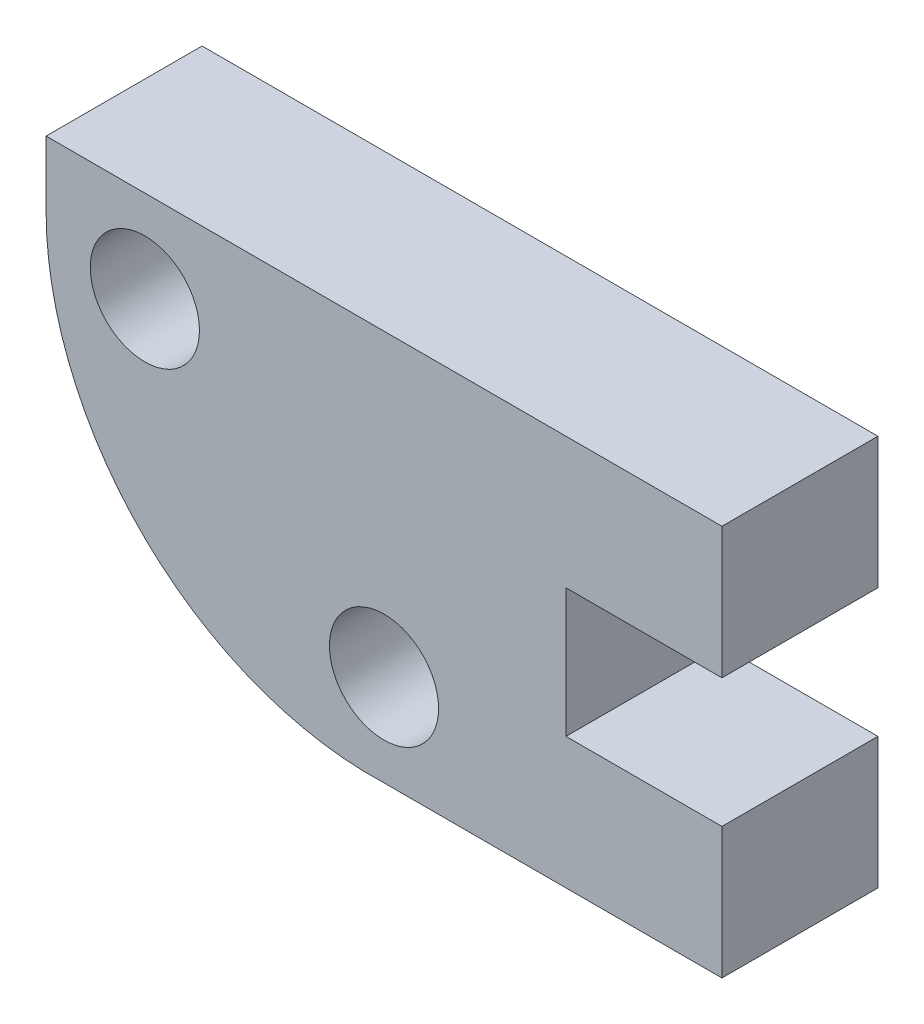
ISO-10303-21;
HEADER;
FILE_DESCRIPTION(('STEP AP214'),'2;1');
FILE_NAME('part.step','',(''),(''),'','','');
FILE_SCHEMA(('AUTOMOTIVE_DESIGN { 1 0 10303 214 1 1 1 1 }'));
ENDSEC;
DATA;
#1=APPLICATION_CONTEXT('core data for automotive mechanical design processes');
#2=APPLICATION_PROTOCOL_DEFINITION('international standard','automotive_design',2000,#1);
#3=PRODUCT_CONTEXT('',#1,'mechanical');
#4=PRODUCT('Part','Part','',(#3));
#5=PRODUCT_RELATED_PRODUCT_CATEGORY('part','',(#4));
#6=PRODUCT_DEFINITION_FORMATION('','',#4);
#7=PRODUCT_DEFINITION_CONTEXT('part definition',#1,'design');
#8=PRODUCT_DEFINITION('design','',#6,#7);
#9=PRODUCT_DEFINITION_SHAPE('','',#8);
#10=(LENGTH_UNIT() NAMED_UNIT(*) SI_UNIT(.MILLI.,.METRE.));
#11=(NAMED_UNIT(*) PLANE_ANGLE_UNIT() SI_UNIT($,.RADIAN.));
#12=(NAMED_UNIT(*) SI_UNIT($,.STERADIAN.) SOLID_ANGLE_UNIT());
#13=UNCERTAINTY_MEASURE_WITH_UNIT(LENGTH_MEASURE(1.E-05),#10,'distance_accuracy_value','');
#14=(GEOMETRIC_REPRESENTATION_CONTEXT(3) GLOBAL_UNCERTAINTY_ASSIGNED_CONTEXT((#13)) GLOBAL_UNIT_ASSIGNED_CONTEXT((#10,
#11,#12)) REPRESENTATION_CONTEXT('',''));
#15=CARTESIAN_POINT('',(0.,0.,0.));
#16=DIRECTION('',(0.,0.,1.));
#17=DIRECTION('',(1.,0.,0.));
#18=AXIS2_PLACEMENT_3D('',#15,#16,#17);
#19=CARTESIAN_POINT('',(-13.4422115384615,-2.5,6.));
#20=DIRECTION('',(0.,0.,1.));
#21=DIRECTION('',(1.,0.,0.));
#22=AXIS2_PLACEMENT_3D('',#19,#20,#21);
#23=PLANE('',#22);
#24=CARTESIAN_POINT('',(-22.2,-3.525,6.));
#25=DIRECTION('',(0.,0.,1.));
#26=DIRECTION('',(1.,0.,0.));
#27=AXIS2_PLACEMENT_3D('',#24,#25,#26);
#28=CIRCLE('',#27,2.1);
#29=CARTESIAN_POINT('',(-20.1,-3.525,6.));
#30=VERTEX_POINT('',#29);
#31=EDGE_CURVE('E144',#30,#30,#28,.T.);
#32=ORIENTED_EDGE('',*,*,#31,.F.);
#33=EDGE_LOOP('',(#32));
#34=FACE_BOUND('',#33,.T.);
#35=DIRECTION('',(-1.,0.,0.));
#36=VECTOR('',#35,1.);
#37=CARTESIAN_POINT('',(-26.,0.,6.));
#38=LINE('',#37,#36);
#39=CARTESIAN_POINT('',(0.,0.,6.));
#40=VERTEX_POINT('',#39);
#41=CARTESIAN_POINT('',(-26.,0.,6.));
#42=VERTEX_POINT('',#41);
#43=EDGE_CURVE('E157',#40,#42,#38,.T.);
#44=ORIENTED_EDGE('',*,*,#43,.T.);
#45=DIRECTION('',(0.,-1.,0.));
#46=VECTOR('',#45,1.);
#47=CARTESIAN_POINT('',(-26.,0.,6.));
#48=LINE('',#47,#46);
#49=CARTESIAN_POINT('',(-26.,-2.5,6.));
#50=VERTEX_POINT('',#49);
#51=EDGE_CURVE('E100',#42,#50,#48,.T.);
#52=ORIENTED_EDGE('',*,*,#51,.T.);
#53=CARTESIAN_POINT('',(-13.4422115384615,-2.5,6.));
#54=DIRECTION('',(0.,0.,1.));
#55=DIRECTION('',(1.,0.,0.));
#56=AXIS2_PLACEMENT_3D('',#53,#54,#55);
#57=CIRCLE('',#56,12.5577884615385);
#58=CARTESIAN_POINT('',(-13.,-15.05,6.));
#59=VERTEX_POINT('',#58);
#60=EDGE_CURVE('E175',#50,#59,#57,.T.);
#61=ORIENTED_EDGE('',*,*,#60,.T.);
#62=DIRECTION('',(1.,0.,0.));
#63=VECTOR('',#62,1.);
#64=CARTESIAN_POINT('',(0.,-15.05,6.));
#65=LINE('',#64,#63);
#66=CARTESIAN_POINT('',(0.,-15.05,6.));
#67=VERTEX_POINT('',#66);
#68=EDGE_CURVE('E192',#59,#67,#65,.T.);
#69=ORIENTED_EDGE('',*,*,#68,.T.);
#70=DIRECTION('',(0.,1.,0.));
#71=VECTOR('',#70,1.);
#72=CARTESIAN_POINT('',(0.,-10.,6.));
#73=LINE('',#72,#71);
#74=CARTESIAN_POINT('',(0.,-10.,6.));
#75=VERTEX_POINT('',#74);
#76=EDGE_CURVE('E191',#67,#75,#73,.T.);
#77=ORIENTED_EDGE('',*,*,#76,.T.);
#78=DIRECTION('',(-1.,0.,0.));
#79=VECTOR('',#78,1.);
#80=CARTESIAN_POINT('',(-6.,-10.,6.));
#81=LINE('',#80,#79);
#82=CARTESIAN_POINT('',(-6.,-10.,6.));
#83=VERTEX_POINT('',#82);
#84=EDGE_CURVE('E122',#75,#83,#81,.T.);
#85=ORIENTED_EDGE('',*,*,#84,.T.);
#86=DIRECTION('',(0.,1.,0.));
#87=VECTOR('',#86,1.);
#88=CARTESIAN_POINT('',(-6.,-5.05,6.));
#89=LINE('',#88,#87);
#90=CARTESIAN_POINT('',(-6.,-5.05,6.));
#91=VERTEX_POINT('',#90);
#92=EDGE_CURVE('E116',#83,#91,#89,.T.);
#93=ORIENTED_EDGE('',*,*,#92,.T.);
#94=DIRECTION('',(1.,0.,0.));
#95=VECTOR('',#94,1.);
#96=CARTESIAN_POINT('',(0.,-5.05,6.));
#97=LINE('',#96,#95);
#98=CARTESIAN_POINT('',(0.,-5.05,6.));
#99=VERTEX_POINT('',#98);
#100=EDGE_CURVE('E120',#91,#99,#97,.T.);
#101=ORIENTED_EDGE('',*,*,#100,.T.);
#102=DIRECTION('',(0.,1.,0.));
#103=VECTOR('',#102,1.);
#104=CARTESIAN_POINT('',(0.,0.,6.));
#105=LINE('',#104,#103);
#106=EDGE_CURVE('E54',#99,#40,#105,.T.);
#107=ORIENTED_EDGE('',*,*,#106,.T.);
#108=EDGE_LOOP('',(#44,#52,#61,#69,#77,#85,#93,#101,#107));
#109=FACE_BOUND('',#108,.T.);
#110=CARTESIAN_POINT('',(-13.,-11.525,6.));
#111=DIRECTION('',(0.,0.,1.));
#112=DIRECTION('',(1.,0.,0.));
#113=AXIS2_PLACEMENT_3D('',#110,#111,#112);
#114=CIRCLE('',#113,2.1);
#115=CARTESIAN_POINT('',(-10.9,-11.525,6.));
#116=VERTEX_POINT('',#115);
#117=EDGE_CURVE('E202',#116,#116,#114,.T.);
#118=ORIENTED_EDGE('',*,*,#117,.F.);
#119=EDGE_LOOP('',(#118));
#120=FACE_BOUND('',#119,.T.);
#121=ADVANCED_FACE('F37',(#34,#109,#120),#23,.T.);
#122=CARTESIAN_POINT('',(-13.4422115384615,-2.5,0.));
#123=DIRECTION('',(0.,0.,1.));
#124=DIRECTION('',(1.,0.,0.));
#125=AXIS2_PLACEMENT_3D('',#122,#123,#124);
#126=PLANE('',#125);
#127=DIRECTION('',(-1.,0.,0.));
#128=VECTOR('',#127,1.);
#129=CARTESIAN_POINT('',(-26.,0.,0.));
#130=LINE('',#129,#128);
#131=CARTESIAN_POINT('',(0.,0.,0.));
#132=VERTEX_POINT('',#131);
#133=CARTESIAN_POINT('',(-26.,0.,0.));
#134=VERTEX_POINT('',#133);
#135=EDGE_CURVE('E140',#132,#134,#130,.T.);
#136=ORIENTED_EDGE('',*,*,#135,.F.);
#137=DIRECTION('',(0.,1.,0.));
#138=VECTOR('',#137,1.);
#139=CARTESIAN_POINT('',(0.,0.,0.));
#140=LINE('',#139,#138);
#141=CARTESIAN_POINT('',(0.,-5.05,0.));
#142=VERTEX_POINT('',#141);
#143=EDGE_CURVE('E92',#142,#132,#140,.T.);
#144=ORIENTED_EDGE('',*,*,#143,.F.);
#145=DIRECTION('',(1.,0.,0.));
#146=VECTOR('',#145,1.);
#147=CARTESIAN_POINT('',(0.,-5.05,0.));
#148=LINE('',#147,#146);
#149=CARTESIAN_POINT('',(-6.,-5.05,0.));
#150=VERTEX_POINT('',#149);
#151=EDGE_CURVE('E86',#150,#142,#148,.T.);
#152=ORIENTED_EDGE('',*,*,#151,.F.);
#153=DIRECTION('',(0.,1.,0.));
#154=VECTOR('',#153,1.);
#155=CARTESIAN_POINT('',(-6.,-5.05,0.));
#156=LINE('',#155,#154);
#157=CARTESIAN_POINT('',(-6.,-10.,0.));
#158=VERTEX_POINT('',#157);
#159=EDGE_CURVE('E130',#158,#150,#156,.T.);
#160=ORIENTED_EDGE('',*,*,#159,.F.);
#161=DIRECTION('',(-1.,0.,0.));
#162=VECTOR('',#161,1.);
#163=CARTESIAN_POINT('',(-6.,-10.,0.));
#164=LINE('',#163,#162);
#165=CARTESIAN_POINT('',(0.,-10.,0.));
#166=VERTEX_POINT('',#165);
#167=EDGE_CURVE('E152',#166,#158,#164,.T.);
#168=ORIENTED_EDGE('',*,*,#167,.F.);
#169=DIRECTION('',(0.,1.,0.));
#170=VECTOR('',#169,1.);
#171=CARTESIAN_POINT('',(0.,-10.,0.));
#172=LINE('',#171,#170);
#173=CARTESIAN_POINT('',(0.,-15.05,0.));
#174=VERTEX_POINT('',#173);
#175=EDGE_CURVE('E150',#174,#166,#172,.T.);
#176=ORIENTED_EDGE('',*,*,#175,.F.);
#177=DIRECTION('',(1.,0.,0.));
#178=VECTOR('',#177,1.);
#179=CARTESIAN_POINT('',(0.,-15.05,0.));
#180=LINE('',#179,#178);
#181=CARTESIAN_POINT('',(-13.,-15.05,0.));
#182=VERTEX_POINT('',#181);
#183=EDGE_CURVE('E148',#182,#174,#180,.T.);
#184=ORIENTED_EDGE('',*,*,#183,.F.);
#185=CARTESIAN_POINT('',(-13.4422115384615,-2.5,0.));
#186=DIRECTION('',(0.,0.,1.));
#187=DIRECTION('',(1.,0.,0.));
#188=AXIS2_PLACEMENT_3D('',#185,#186,#187);
#189=CIRCLE('',#188,12.5577884615385);
#190=CARTESIAN_POINT('',(-26.,-2.5,0.));
#191=VERTEX_POINT('',#190);
#192=EDGE_CURVE('E146',#191,#182,#189,.T.);
#193=ORIENTED_EDGE('',*,*,#192,.F.);
#194=DIRECTION('',(0.,-1.,0.));
#195=VECTOR('',#194,1.);
#196=CARTESIAN_POINT('',(-26.,0.,0.));
#197=LINE('',#196,#195);
#198=EDGE_CURVE('E143',#134,#191,#197,.T.);
#199=ORIENTED_EDGE('',*,*,#198,.F.);
#200=EDGE_LOOP('',(#136,#144,#152,#160,#168,#176,#184,#193,#199));
#201=FACE_BOUND('',#200,.T.);
#202=CARTESIAN_POINT('',(-22.2,-3.525,0.));
#203=DIRECTION('',(0.,0.,1.));
#204=DIRECTION('',(1.,0.,0.));
#205=AXIS2_PLACEMENT_3D('',#202,#203,#204);
#206=CIRCLE('',#205,2.1);
#207=CARTESIAN_POINT('',(-20.1,-3.525,0.));
#208=VERTEX_POINT('',#207);
#209=EDGE_CURVE('E199',#208,#208,#206,.T.);
#210=ORIENTED_EDGE('',*,*,#209,.T.);
#211=EDGE_LOOP('',(#210));
#212=FACE_BOUND('',#211,.T.);
#213=CARTESIAN_POINT('',(-13.,-11.525,0.));
#214=DIRECTION('',(0.,0.,1.));
#215=DIRECTION('',(1.,0.,0.));
#216=AXIS2_PLACEMENT_3D('',#213,#214,#215);
#217=CIRCLE('',#216,2.1);
#218=CARTESIAN_POINT('',(-10.9,-11.525,0.));
#219=VERTEX_POINT('',#218);
#220=EDGE_CURVE('E205',#219,#219,#217,.T.);
#221=ORIENTED_EDGE('',*,*,#220,.T.);
#222=EDGE_LOOP('',(#221));
#223=FACE_BOUND('',#222,.T.);
#224=ADVANCED_FACE('F179',(#201,#212,#223),#126,.F.);
#225=CARTESIAN_POINT('',(-26.,0.,6.));
#226=DIRECTION('',(0.,-1.,0.));
#227=DIRECTION('',(0.,0.,-1.));
#228=AXIS2_PLACEMENT_3D('',#225,#226,#227);
#229=PLANE('',#228);
#230=ORIENTED_EDGE('',*,*,#135,.T.);
#231=DIRECTION('',(0.,0.,-1.));
#232=VECTOR('',#231,1.);
#233=CARTESIAN_POINT('',(-26.,0.,6.));
#234=LINE('',#233,#232);
#235=EDGE_CURVE('E11',#42,#134,#234,.T.);
#236=ORIENTED_EDGE('',*,*,#235,.F.);
#237=ORIENTED_EDGE('',*,*,#43,.F.);
#238=DIRECTION('',(0.,0.,-1.));
#239=VECTOR('',#238,1.);
#240=CARTESIAN_POINT('',(0.,0.,6.));
#241=LINE('',#240,#239);
#242=EDGE_CURVE('E136',#40,#132,#241,.T.);
#243=ORIENTED_EDGE('',*,*,#242,.T.);
#244=EDGE_LOOP('',(#230,#236,#237,#243));
#245=FACE_BOUND('',#244,.T.);
#246=ADVANCED_FACE('F39',(#245),#229,.F.);
#247=CARTESIAN_POINT('',(-26.,0.,6.));
#248=DIRECTION('',(1.,0.,0.));
#249=DIRECTION('',(0.,0.,-1.));
#250=AXIS2_PLACEMENT_3D('',#247,#248,#249);
#251=PLANE('',#250);
#252=ORIENTED_EDGE('',*,*,#198,.T.);
#253=DIRECTION('',(0.,0.,-1.));
#254=VECTOR('',#253,1.);
#255=CARTESIAN_POINT('',(-26.,-2.5,6.));
#256=LINE('',#255,#254);
#257=EDGE_CURVE('E46',#50,#191,#256,.T.);
#258=ORIENTED_EDGE('',*,*,#257,.F.);
#259=ORIENTED_EDGE('',*,*,#51,.F.);
#260=ORIENTED_EDGE('',*,*,#235,.T.);
#261=EDGE_LOOP('',(#252,#258,#259,#260));
#262=FACE_BOUND('',#261,.T.);
#263=ADVANCED_FACE('F241',(#262),#251,.F.);
#264=CARTESIAN_POINT('',(-13.4422115384615,-2.5,6.));
#265=DIRECTION('',(0.,0.,-1.));
#266=DIRECTION('',(-1.,0.,0.));
#267=AXIS2_PLACEMENT_3D('',#264,#265,#266);
#268=CYLINDRICAL_SURFACE('',#267,12.5577884615385);
#269=ORIENTED_EDGE('',*,*,#192,.T.);
#270=DIRECTION('',(0.,0.,-1.));
#271=VECTOR('',#270,1.);
#272=CARTESIAN_POINT('',(-13.,-15.05,6.));
#273=LINE('',#272,#271);
#274=EDGE_CURVE('E167',#59,#182,#273,.T.);
#275=ORIENTED_EDGE('',*,*,#274,.F.);
#276=ORIENTED_EDGE('',*,*,#60,.F.);
#277=ORIENTED_EDGE('',*,*,#257,.T.);
#278=EDGE_LOOP('',(#269,#275,#276,#277));
#279=FACE_BOUND('',#278,.T.);
#280=ADVANCED_FACE('F173',(#279),#268,.T.);
#281=CARTESIAN_POINT('',(0.,-15.05,6.));
#282=DIRECTION('',(0.,1.,0.));
#283=DIRECTION('',(-1.,0.,0.));
#284=AXIS2_PLACEMENT_3D('',#281,#282,#283);
#285=PLANE('',#284);
#286=ORIENTED_EDGE('',*,*,#183,.T.);
#287=DIRECTION('',(0.,0.,-1.));
#288=VECTOR('',#287,1.);
#289=CARTESIAN_POINT('',(0.,-15.05,6.));
#290=LINE('',#289,#288);
#291=EDGE_CURVE('E164',#67,#174,#290,.T.);
#292=ORIENTED_EDGE('',*,*,#291,.F.);
#293=ORIENTED_EDGE('',*,*,#68,.F.);
#294=ORIENTED_EDGE('',*,*,#274,.T.);
#295=EDGE_LOOP('',(#286,#292,#293,#294));
#296=FACE_BOUND('',#295,.T.);
#297=ADVANCED_FACE('F185',(#296),#285,.F.);
#298=CARTESIAN_POINT('',(0.,-10.,6.));
#299=DIRECTION('',(-1.,0.,0.));
#300=DIRECTION('',(0.,-1.,0.));
#301=AXIS2_PLACEMENT_3D('',#298,#299,#300);
#302=PLANE('',#301);
#303=ORIENTED_EDGE('',*,*,#175,.T.);
#304=DIRECTION('',(0.,0.,-1.));
#305=VECTOR('',#304,1.);
#306=CARTESIAN_POINT('',(0.,-10.,6.));
#307=LINE('',#306,#305);
#308=EDGE_CURVE('E161',#75,#166,#307,.T.);
#309=ORIENTED_EDGE('',*,*,#308,.F.);
#310=ORIENTED_EDGE('',*,*,#76,.F.);
#311=ORIENTED_EDGE('',*,*,#291,.T.);
#312=EDGE_LOOP('',(#303,#309,#310,#311));
#313=FACE_BOUND('',#312,.T.);
#314=ADVANCED_FACE('F189',(#313),#302,.F.);
#315=CARTESIAN_POINT('',(-6.,-10.,6.));
#316=DIRECTION('',(0.,-1.,0.));
#317=DIRECTION('',(0.,0.,-1.));
#318=AXIS2_PLACEMENT_3D('',#315,#316,#317);
#319=PLANE('',#318);
#320=ORIENTED_EDGE('',*,*,#167,.T.);
#321=DIRECTION('',(0.,0.,-1.));
#322=VECTOR('',#321,1.);
#323=CARTESIAN_POINT('',(-6.,-10.,6.));
#324=LINE('',#323,#322);
#325=EDGE_CURVE('E131',#83,#158,#324,.T.);
#326=ORIENTED_EDGE('',*,*,#325,.F.);
#327=ORIENTED_EDGE('',*,*,#84,.F.);
#328=ORIENTED_EDGE('',*,*,#308,.T.);
#329=EDGE_LOOP('',(#320,#326,#327,#328));
#330=FACE_BOUND('',#329,.T.);
#331=ADVANCED_FACE('F232',(#330),#319,.F.);
#332=CARTESIAN_POINT('',(-6.,-5.05,6.));
#333=DIRECTION('',(-1.,0.,0.));
#334=DIRECTION('',(0.,-1.,0.));
#335=AXIS2_PLACEMENT_3D('',#332,#333,#334);
#336=PLANE('',#335);
#337=ORIENTED_EDGE('',*,*,#159,.T.);
#338=DIRECTION('',(0.,0.,-1.));
#339=VECTOR('',#338,1.);
#340=CARTESIAN_POINT('',(-6.,-5.05,6.));
#341=LINE('',#340,#339);
#342=EDGE_CURVE('E127',#91,#150,#341,.T.);
#343=ORIENTED_EDGE('',*,*,#342,.F.);
#344=ORIENTED_EDGE('',*,*,#92,.F.);
#345=ORIENTED_EDGE('',*,*,#325,.T.);
#346=EDGE_LOOP('',(#337,#343,#344,#345));
#347=FACE_BOUND('',#346,.T.);
#348=ADVANCED_FACE('F128',(#347),#336,.F.);
#349=CARTESIAN_POINT('',(0.,-5.05,6.));
#350=DIRECTION('',(0.,1.,0.));
#351=DIRECTION('',(-1.,0.,0.));
#352=AXIS2_PLACEMENT_3D('',#349,#350,#351);
#353=PLANE('',#352);
#354=ORIENTED_EDGE('',*,*,#151,.T.);
#355=DIRECTION('',(0.,0.,-1.));
#356=VECTOR('',#355,1.);
#357=CARTESIAN_POINT('',(0.,-5.05,6.));
#358=LINE('',#357,#356);
#359=EDGE_CURVE('E132',#99,#142,#358,.T.);
#360=ORIENTED_EDGE('',*,*,#359,.F.);
#361=ORIENTED_EDGE('',*,*,#100,.F.);
#362=ORIENTED_EDGE('',*,*,#342,.T.);
#363=EDGE_LOOP('',(#354,#360,#361,#362));
#364=FACE_BOUND('',#363,.T.);
#365=ADVANCED_FACE('F134',(#364),#353,.F.);
#366=CARTESIAN_POINT('',(0.,0.,6.));
#367=DIRECTION('',(-1.,0.,0.));
#368=DIRECTION('',(0.,-1.,0.));
#369=AXIS2_PLACEMENT_3D('',#366,#367,#368);
#370=PLANE('',#369);
#371=ORIENTED_EDGE('',*,*,#143,.T.);
#372=ORIENTED_EDGE('',*,*,#242,.F.);
#373=ORIENTED_EDGE('',*,*,#106,.F.);
#374=ORIENTED_EDGE('',*,*,#359,.T.);
#375=EDGE_LOOP('',(#371,#372,#373,#374));
#376=FACE_BOUND('',#375,.T.);
#377=ADVANCED_FACE('F225',(#376),#370,.F.);
#378=CARTESIAN_POINT('',(-22.2,-3.525,6.));
#379=DIRECTION('',(0.,0.,-1.));
#380=DIRECTION('',(-1.,0.,0.));
#381=AXIS2_PLACEMENT_3D('',#378,#379,#380);
#382=CYLINDRICAL_SURFACE('',#381,2.1);
#383=ORIENTED_EDGE('',*,*,#31,.T.);
#384=EDGE_LOOP('',(#383));
#385=FACE_BOUND('',#384,.T.);
#386=ORIENTED_EDGE('',*,*,#209,.F.);
#387=EDGE_LOOP('',(#386));
#388=FACE_BOUND('',#387,.T.);
#389=ADVANCED_FACE('F222',(#385,#388),#382,.F.);
#390=CARTESIAN_POINT('',(-13.,-11.525,6.));
#391=DIRECTION('',(0.,0.,-1.));
#392=DIRECTION('',(-1.,0.,0.));
#393=AXIS2_PLACEMENT_3D('',#390,#391,#392);
#394=CYLINDRICAL_SURFACE('',#393,2.1);
#395=ORIENTED_EDGE('',*,*,#117,.T.);
#396=EDGE_LOOP('',(#395));
#397=FACE_BOUND('',#396,.T.);
#398=ORIENTED_EDGE('',*,*,#220,.F.);
#399=EDGE_LOOP('',(#398));
#400=FACE_BOUND('',#399,.T.);
#401=ADVANCED_FACE('F211',(#397,#400),#394,.F.);
#402=CLOSED_SHELL('',(#121,#224,#246,#263,#280,#297,#314,#331,#348,#365,#377,#389,#401));
#403=MANIFOLD_SOLID_BREP('B2',#402);
#404=ADVANCED_BREP_SHAPE_REPRESENTATION('',(#18,#403),#14);
#405=SHAPE_DEFINITION_REPRESENTATION(#9,#404);
ENDSEC;
END-ISO-10303-21;
